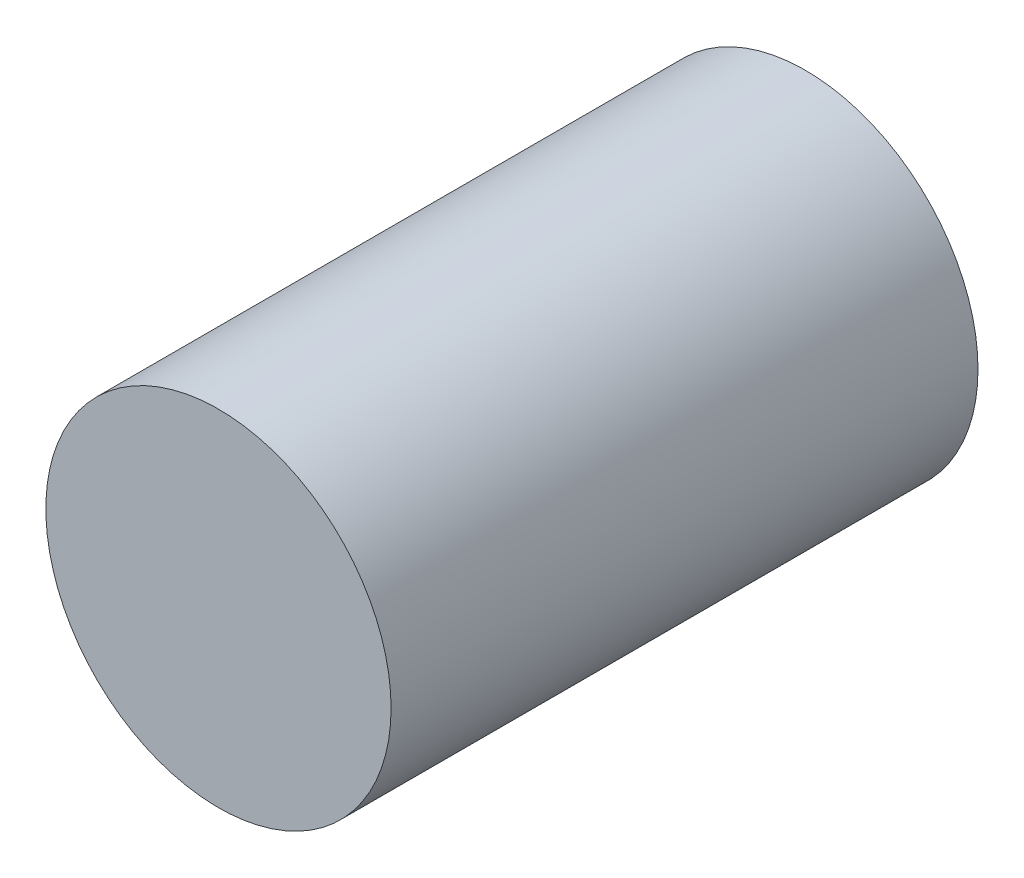
ISO-10303-21;
HEADER;
FILE_DESCRIPTION(('STEP AP214'),'2;1');
FILE_NAME('part.step','',(''),(''),'','','');
FILE_SCHEMA(('AUTOMOTIVE_DESIGN { 1 0 10303 214 1 1 1 1 }'));
ENDSEC;
DATA;
#1=APPLICATION_CONTEXT('core data for automotive mechanical design processes');
#2=APPLICATION_PROTOCOL_DEFINITION('international standard','automotive_design',2000,#1);
#3=PRODUCT_CONTEXT('',#1,'mechanical');
#4=PRODUCT('Part','Part','',(#3));
#5=PRODUCT_RELATED_PRODUCT_CATEGORY('part','',(#4));
#6=PRODUCT_DEFINITION_FORMATION('','',#4);
#7=PRODUCT_DEFINITION_CONTEXT('part definition',#1,'design');
#8=PRODUCT_DEFINITION('design','',#6,#7);
#9=PRODUCT_DEFINITION_SHAPE('','',#8);
#10=(LENGTH_UNIT() NAMED_UNIT(*) SI_UNIT(.MILLI.,.METRE.));
#11=(NAMED_UNIT(*) PLANE_ANGLE_UNIT() SI_UNIT($,.RADIAN.));
#12=(NAMED_UNIT(*) SI_UNIT($,.STERADIAN.) SOLID_ANGLE_UNIT());
#13=UNCERTAINTY_MEASURE_WITH_UNIT(LENGTH_MEASURE(1.E-05),#10,'distance_accuracy_value','');
#14=(GEOMETRIC_REPRESENTATION_CONTEXT(3) GLOBAL_UNCERTAINTY_ASSIGNED_CONTEXT((#13)) GLOBAL_UNIT_ASSIGNED_CONTEXT((#10,
#11,#12)) REPRESENTATION_CONTEXT('',''));
#15=CARTESIAN_POINT('',(0.,0.,0.));
#16=DIRECTION('',(0.,0.,1.));
#17=DIRECTION('',(1.,0.,0.));
#18=AXIS2_PLACEMENT_3D('',#15,#16,#17);
#19=CARTESIAN_POINT('',(0.,0.,8.5));
#20=DIRECTION('',(0.,0.,-1.));
#21=DIRECTION('',(-1.,0.,0.));
#22=AXIS2_PLACEMENT_3D('',#19,#20,#21);
#23=CYLINDRICAL_SURFACE('',#22,2.5);
#24=CARTESIAN_POINT('',(0.,0.,8.5));
#25=DIRECTION('',(0.,0.,1.));
#26=DIRECTION('',(1.,0.,0.));
#27=AXIS2_PLACEMENT_3D('',#24,#25,#26);
#28=CIRCLE('',#27,2.5);
#29=CARTESIAN_POINT('',(2.5,0.,8.5));
#30=VERTEX_POINT('',#29);
#31=EDGE_CURVE('E10',#30,#30,#28,.T.);
#32=ORIENTED_EDGE('',*,*,#31,.F.);
#33=EDGE_LOOP('',(#32));
#34=FACE_BOUND('',#33,.T.);
#35=CARTESIAN_POINT('',(0.,0.,0.));
#36=DIRECTION('',(0.,0.,1.));
#37=DIRECTION('',(1.,0.,0.));
#38=AXIS2_PLACEMENT_3D('',#35,#36,#37);
#39=CIRCLE('',#38,2.5);
#40=CARTESIAN_POINT('',(2.5,0.,0.));
#41=VERTEX_POINT('',#40);
#42=EDGE_CURVE('E36',#41,#41,#39,.T.);
#43=ORIENTED_EDGE('',*,*,#42,.T.);
#44=EDGE_LOOP('',(#43));
#45=FACE_BOUND('',#44,.T.);
#46=ADVANCED_FACE('F33',(#34,#45),#23,.T.);
#47=CARTESIAN_POINT('',(0.,0.,8.5));
#48=DIRECTION('',(0.,0.,1.));
#49=DIRECTION('',(1.,0.,0.));
#50=AXIS2_PLACEMENT_3D('',#47,#48,#49);
#51=PLANE('',#50);
#52=ORIENTED_EDGE('',*,*,#31,.T.);
#53=EDGE_LOOP('',(#52));
#54=FACE_BOUND('',#53,.T.);
#55=ADVANCED_FACE('F48',(#54),#51,.T.);
#56=CARTESIAN_POINT('',(0.,0.,0.));
#57=DIRECTION('',(0.,0.,1.));
#58=DIRECTION('',(1.,0.,0.));
#59=AXIS2_PLACEMENT_3D('',#56,#57,#58);
#60=PLANE('',#59);
#61=ORIENTED_EDGE('',*,*,#42,.F.);
#62=EDGE_LOOP('',(#61));
#63=FACE_BOUND('',#62,.T.);
#64=ADVANCED_FACE('F46',(#63),#60,.F.);
#65=CLOSED_SHELL('',(#46,#55,#64));
#66=MANIFOLD_SOLID_BREP('B2',#65);
#67=ADVANCED_BREP_SHAPE_REPRESENTATION('',(#18,#66),#14);
#68=SHAPE_DEFINITION_REPRESENTATION(#9,#67);
ENDSEC;
END-ISO-10303-21;
